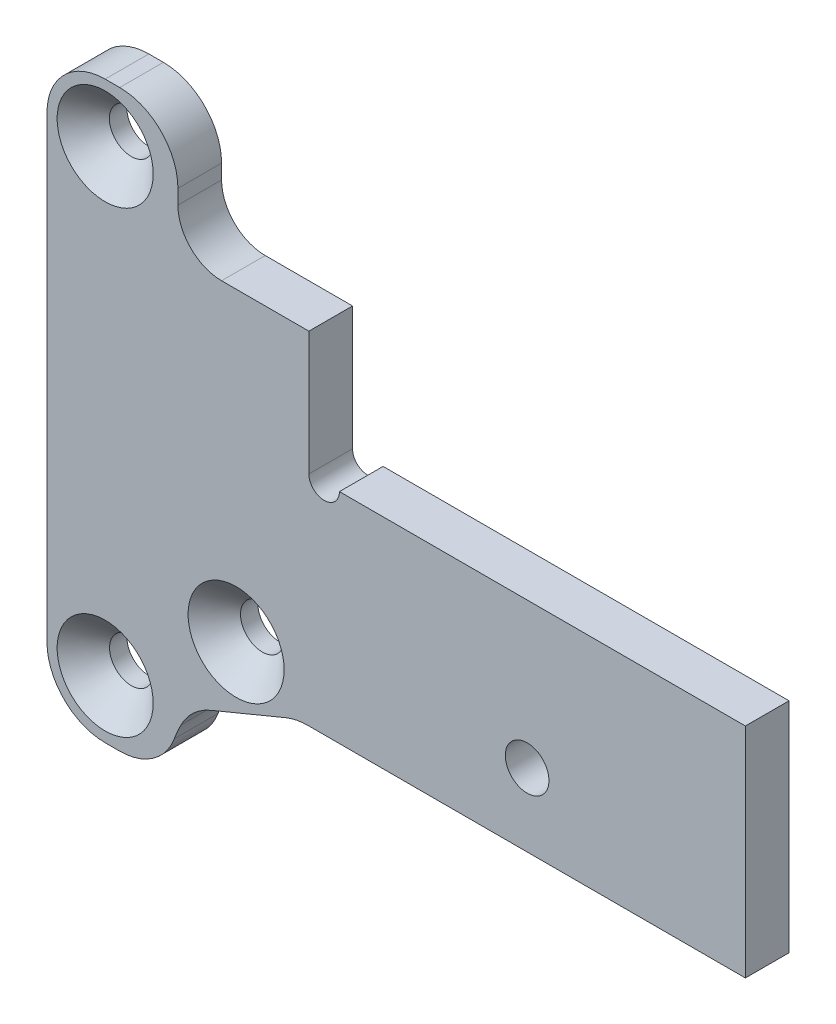
ISO-10303-21;
HEADER;
FILE_DESCRIPTION(('STEP AP214'),'2;1');
FILE_NAME('part.step','',(''),(''),'','','');
FILE_SCHEMA(('AUTOMOTIVE_DESIGN { 1 0 10303 214 1 1 1 1 }'));
ENDSEC;
DATA;
#1=APPLICATION_CONTEXT('core data for automotive mechanical design processes');
#2=APPLICATION_PROTOCOL_DEFINITION('international standard','automotive_design',2000,#1);
#3=PRODUCT_CONTEXT('',#1,'mechanical');
#4=PRODUCT('Part','Part','',(#3));
#5=PRODUCT_RELATED_PRODUCT_CATEGORY('part','',(#4));
#6=PRODUCT_DEFINITION_FORMATION('','',#4);
#7=PRODUCT_DEFINITION_CONTEXT('part definition',#1,'design');
#8=PRODUCT_DEFINITION('design','',#6,#7);
#9=PRODUCT_DEFINITION_SHAPE('','',#8);
#10=(LENGTH_UNIT() NAMED_UNIT(*) SI_UNIT(.MILLI.,.METRE.));
#11=(NAMED_UNIT(*) PLANE_ANGLE_UNIT() SI_UNIT($,.RADIAN.));
#12=(NAMED_UNIT(*) SI_UNIT($,.STERADIAN.) SOLID_ANGLE_UNIT());
#13=UNCERTAINTY_MEASURE_WITH_UNIT(LENGTH_MEASURE(1.E-05),#10,'distance_accuracy_value','');
#14=(GEOMETRIC_REPRESENTATION_CONTEXT(3) GLOBAL_UNCERTAINTY_ASSIGNED_CONTEXT((#13)) GLOBAL_UNIT_ASSIGNED_CONTEXT((#10,
#11,#12)) REPRESENTATION_CONTEXT('',''));
#15=CARTESIAN_POINT('',(0.,0.,0.));
#16=DIRECTION('',(0.,0.,1.));
#17=DIRECTION('',(1.,0.,0.));
#18=AXIS2_PLACEMENT_3D('',#15,#16,#17);
#19=CARTESIAN_POINT('',(15.,-7.5,3.));
#20=DIRECTION('',(-1.,0.,0.));
#21=DIRECTION('',(0.,0.,1.));
#22=AXIS2_PLACEMENT_3D('',#19,#20,#21);
#23=PLANE('',#22);
#24=DIRECTION('',(0.,1.,0.));
#25=VECTOR('',#24,1.);
#26=CARTESIAN_POINT('',(15.,-7.5,0.));
#27=LINE('',#26,#25);
#28=CARTESIAN_POINT('',(15.,-7.5,0.));
#29=VERTEX_POINT('',#28);
#30=CARTESIAN_POINT('',(15.,7.5,0.));
#31=VERTEX_POINT('',#30);
#32=EDGE_CURVE('E199',#29,#31,#27,.T.);
#33=ORIENTED_EDGE('',*,*,#32,.T.);
#34=DIRECTION('',(0.,0.,-1.));
#35=VECTOR('',#34,1.);
#36=CARTESIAN_POINT('',(15.,7.5,3.));
#37=LINE('',#36,#35);
#38=CARTESIAN_POINT('',(15.,7.5,3.));
#39=VERTEX_POINT('',#38);
#40=EDGE_CURVE('E208',#39,#31,#37,.T.);
#41=ORIENTED_EDGE('',*,*,#40,.F.);
#42=DIRECTION('',(0.,1.,0.));
#43=VECTOR('',#42,1.);
#44=CARTESIAN_POINT('',(15.,-7.5,3.));
#45=LINE('',#44,#43);
#46=CARTESIAN_POINT('',(15.,-7.5,3.));
#47=VERTEX_POINT('',#46);
#48=EDGE_CURVE('E189',#47,#39,#45,.T.);
#49=ORIENTED_EDGE('',*,*,#48,.F.);
#50=DIRECTION('',(0.,0.,-1.));
#51=VECTOR('',#50,1.);
#52=CARTESIAN_POINT('',(15.,-7.5,3.));
#53=LINE('',#52,#51);
#54=EDGE_CURVE('E193',#47,#29,#53,.T.);
#55=ORIENTED_EDGE('',*,*,#54,.T.);
#56=EDGE_LOOP('',(#33,#41,#49,#55));
#57=FACE_BOUND('',#56,.T.);
#58=ADVANCED_FACE('F35',(#57),#23,.F.);
#59=CARTESIAN_POINT('',(-15.,7.5,3.));
#60=DIRECTION('',(0.,-1.,0.));
#61=DIRECTION('',(0.,0.,-1.));
#62=AXIS2_PLACEMENT_3D('',#59,#60,#61);
#63=PLANE('',#62);
#64=DIRECTION('',(-1.,0.,0.));
#65=VECTOR('',#64,1.);
#66=CARTESIAN_POINT('',(-15.,7.5,0.));
#67=LINE('',#66,#65);
#68=CARTESIAN_POINT('',(-12.9,7.5,0.));
#69=VERTEX_POINT('',#68);
#70=EDGE_CURVE('E184',#31,#69,#67,.T.);
#71=ORIENTED_EDGE('',*,*,#70,.T.);
#72=DIRECTION('',(0.,0.,1.));
#73=VECTOR('',#72,1.);
#74=CARTESIAN_POINT('',(-12.9,7.5,0.));
#75=LINE('',#74,#73);
#76=CARTESIAN_POINT('',(-12.9,7.5,3.));
#77=VERTEX_POINT('',#76);
#78=EDGE_CURVE('E168',#69,#77,#75,.T.);
#79=ORIENTED_EDGE('',*,*,#78,.T.);
#80=DIRECTION('',(-1.,0.,0.));
#81=VECTOR('',#80,1.);
#82=CARTESIAN_POINT('',(-15.,7.5,3.));
#83=LINE('',#82,#81);
#84=EDGE_CURVE('E182',#39,#77,#83,.T.);
#85=ORIENTED_EDGE('',*,*,#84,.F.);
#86=ORIENTED_EDGE('',*,*,#40,.T.);
#87=EDGE_LOOP('',(#71,#79,#85,#86));
#88=FACE_BOUND('',#87,.T.);
#89=ADVANCED_FACE('F180',(#88),#63,.F.);
#90=CARTESIAN_POINT('',(-15.,-7.5,3.));
#91=DIRECTION('',(0.,1.,0.));
#92=DIRECTION('',(0.,0.,1.));
#93=AXIS2_PLACEMENT_3D('',#90,#91,#92);
#94=PLANE('',#93);
#95=DIRECTION('',(1.,0.,0.));
#96=VECTOR('',#95,1.);
#97=CARTESIAN_POINT('',(-15.,-7.5,3.));
#98=LINE('',#97,#96);
#99=CARTESIAN_POINT('',(-15.0622149067504,-7.5,3.));
#100=VERTEX_POINT('',#99);
#101=EDGE_CURVE('E191',#100,#47,#98,.T.);
#102=ORIENTED_EDGE('',*,*,#101,.F.);
#103=DIRECTION('',(0.,0.,-1.));
#104=VECTOR('',#103,1.);
#105=CARTESIAN_POINT('',(-15.0622149067504,-7.5,3.));
#106=LINE('',#105,#104);
#107=CARTESIAN_POINT('',(-15.0622149067504,-7.5,0.));
#108=VERTEX_POINT('',#107);
#109=EDGE_CURVE('E268',#100,#108,#106,.T.);
#110=ORIENTED_EDGE('',*,*,#109,.T.);
#111=DIRECTION('',(1.,0.,0.));
#112=VECTOR('',#111,1.);
#113=CARTESIAN_POINT('',(-15.,-7.5,0.));
#114=LINE('',#113,#112);
#115=EDGE_CURVE('E195',#108,#29,#114,.T.);
#116=ORIENTED_EDGE('',*,*,#115,.T.);
#117=ORIENTED_EDGE('',*,*,#54,.F.);
#118=EDGE_LOOP('',(#102,#110,#116,#117));
#119=FACE_BOUND('',#118,.T.);
#120=ADVANCED_FACE('F401',(#119),#94,.F.);
#121=CARTESIAN_POINT('',(0.,0.,3.));
#122=DIRECTION('',(0.,0.,-1.));
#123=DIRECTION('',(-1.,0.,0.));
#124=AXIS2_PLACEMENT_3D('',#121,#122,#123);
#125=PLANE('',#124);
#126=CARTESIAN_POINT('',(3.33066907387547E-13,-2.49999999999997,3.));
#127=DIRECTION('',(0.,0.,-1.));
#128=DIRECTION('',(-1.,0.,0.));
#129=AXIS2_PLACEMENT_3D('',#126,#127,#128);
#130=CIRCLE('',#129,1.5);
#131=CARTESIAN_POINT('',(-1.49999999999966,-2.49999999999997,3.));
#132=VERTEX_POINT('',#131);
#133=EDGE_CURVE('E656',#132,#132,#130,.T.);
#134=ORIENTED_EDGE('',*,*,#133,.T.);
#135=EDGE_LOOP('',(#134));
#136=FACE_BOUND('',#135,.T.);
#137=CARTESIAN_POINT('',(-29.,20.,3.));
#138=DIRECTION('',(0.,0.,1.));
#139=DIRECTION('',(1.,0.,0.));
#140=AXIS2_PLACEMENT_3D('',#137,#138,#139);
#141=CIRCLE('',#140,3.3);
#142=CARTESIAN_POINT('',(-25.7,20.,3.));
#143=VERTEX_POINT('',#142);
#144=EDGE_CURVE('E276',#143,#143,#141,.T.);
#145=ORIENTED_EDGE('',*,*,#144,.F.);
#146=EDGE_LOOP('',(#145));
#147=FACE_BOUND('',#146,.T.);
#148=CARTESIAN_POINT('',(-20.,-5.,3.));
#149=DIRECTION('',(0.,0.,1.));
#150=DIRECTION('',(1.,0.,0.));
#151=AXIS2_PLACEMENT_3D('',#148,#149,#150);
#152=CIRCLE('',#151,3.3);
#153=CARTESIAN_POINT('',(-16.7,-5.,3.));
#154=VERTEX_POINT('',#153);
#155=EDGE_CURVE('E275',#154,#154,#152,.T.);
#156=ORIENTED_EDGE('',*,*,#155,.F.);
#157=EDGE_LOOP('',(#156));
#158=FACE_BOUND('',#157,.T.);
#159=CARTESIAN_POINT('',(-29.,-11.5,3.));
#160=DIRECTION('',(0.,0.,1.));
#161=DIRECTION('',(1.,0.,0.));
#162=AXIS2_PLACEMENT_3D('',#159,#160,#161);
#163=CIRCLE('',#162,3.3);
#164=CARTESIAN_POINT('',(-25.7,-11.5,3.));
#165=VERTEX_POINT('',#164);
#166=EDGE_CURVE('E666',#165,#165,#163,.T.);
#167=ORIENTED_EDGE('',*,*,#166,.F.);
#168=EDGE_LOOP('',(#167));
#169=FACE_BOUND('',#168,.T.);
#170=ORIENTED_EDGE('',*,*,#84,.T.);
#171=CARTESIAN_POINT('',(-13.95,7.5,3.));
#172=DIRECTION('',(0.,0.,1.));
#173=DIRECTION('',(1.,0.,0.));
#174=AXIS2_PLACEMENT_3D('',#171,#172,#173);
#175=CIRCLE('',#174,1.05);
#176=CARTESIAN_POINT('',(-15.,7.5,3.));
#177=VERTEX_POINT('',#176);
#178=EDGE_CURVE('E165',#177,#77,#175,.T.);
#179=ORIENTED_EDGE('',*,*,#178,.F.);
#180=DIRECTION('',(0.,1.,0.));
#181=VECTOR('',#180,1.);
#182=CARTESIAN_POINT('',(-15.,7.5,3.));
#183=LINE('',#182,#181);
#184=CARTESIAN_POINT('',(-15.,16.,3.));
#185=VERTEX_POINT('',#184);
#186=EDGE_CURVE('E185',#177,#185,#183,.T.);
#187=ORIENTED_EDGE('',*,*,#186,.T.);
#188=DIRECTION('',(-1.,0.,0.));
#189=VECTOR('',#188,1.);
#190=CARTESIAN_POINT('',(-15.,16.,3.));
#191=LINE('',#190,#189);
#192=CARTESIAN_POINT('',(-21.,16.,3.));
#193=VERTEX_POINT('',#192);
#194=EDGE_CURVE('E329',#185,#193,#191,.T.);
#195=ORIENTED_EDGE('',*,*,#194,.T.);
#196=CARTESIAN_POINT('',(-21.,19.,3.));
#197=DIRECTION('',(0.,0.,-1.));
#198=DIRECTION('',(-1.,0.,0.));
#199=AXIS2_PLACEMENT_3D('',#196,#197,#198);
#200=CIRCLE('',#199,3.);
#201=CARTESIAN_POINT('',(-24.,19.,3.));
#202=VERTEX_POINT('',#201);
#203=EDGE_CURVE('E234',#193,#202,#200,.T.);
#204=ORIENTED_EDGE('',*,*,#203,.T.);
#205=DIRECTION('',(0.,1.,0.));
#206=VECTOR('',#205,1.);
#207=CARTESIAN_POINT('',(-24.,16.,3.));
#208=LINE('',#207,#206);
#209=CARTESIAN_POINT('',(-24.,20.,3.));
#210=VERTEX_POINT('',#209);
#211=EDGE_CURVE('E327',#202,#210,#208,.T.);
#212=ORIENTED_EDGE('',*,*,#211,.T.);
#213=CARTESIAN_POINT('',(-28.,20.,3.));
#214=DIRECTION('',(0.,0.,-1.));
#215=DIRECTION('',(-1.,0.,0.));
#216=AXIS2_PLACEMENT_3D('',#213,#214,#215);
#217=CIRCLE('',#216,4.);
#218=CARTESIAN_POINT('',(-28.,24.,3.));
#219=VERTEX_POINT('',#218);
#220=EDGE_CURVE('E215',#210,#219,#217,.F.);
#221=ORIENTED_EDGE('',*,*,#220,.T.);
#222=DIRECTION('',(-1.,0.,0.));
#223=VECTOR('',#222,1.);
#224=CARTESIAN_POINT('',(-24.,24.,3.));
#225=LINE('',#224,#223);
#226=CARTESIAN_POINT('',(-29.,24.,3.));
#227=VERTEX_POINT('',#226);
#228=EDGE_CURVE('E322',#219,#227,#225,.T.);
#229=ORIENTED_EDGE('',*,*,#228,.T.);
#230=CARTESIAN_POINT('',(-29.,20.,3.));
#231=DIRECTION('',(0.,0.,-1.));
#232=DIRECTION('',(-1.,0.,0.));
#233=AXIS2_PLACEMENT_3D('',#230,#231,#232);
#234=CIRCLE('',#233,4.);
#235=CARTESIAN_POINT('',(-33.,20.,3.));
#236=VERTEX_POINT('',#235);
#237=EDGE_CURVE('E217',#227,#236,#234,.F.);
#238=ORIENTED_EDGE('',*,*,#237,.T.);
#239=DIRECTION('',(0.,-1.,0.));
#240=VECTOR('',#239,1.);
#241=CARTESIAN_POINT('',(-33.,24.,3.));
#242=LINE('',#241,#240);
#243=CARTESIAN_POINT('',(-33.,-11.5,3.));
#244=VERTEX_POINT('',#243);
#245=EDGE_CURVE('E318',#236,#244,#242,.T.);
#246=ORIENTED_EDGE('',*,*,#245,.T.);
#247=CARTESIAN_POINT('',(-29.,-11.5,3.));
#248=DIRECTION('',(0.,0.,-1.));
#249=DIRECTION('',(-1.,0.,0.));
#250=AXIS2_PLACEMENT_3D('',#247,#248,#249);
#251=CIRCLE('',#250,4.);
#252=CARTESIAN_POINT('',(-29.,-15.5,3.));
#253=VERTEX_POINT('',#252);
#254=EDGE_CURVE('E243',#244,#253,#251,.F.);
#255=ORIENTED_EDGE('',*,*,#254,.T.);
#256=DIRECTION('',(1.,0.,0.));
#257=VECTOR('',#256,1.);
#258=CARTESIAN_POINT('',(-33.,-15.5,3.));
#259=LINE('',#258,#257);
#260=CARTESIAN_POINT('',(-28.,-15.5,3.));
#261=VERTEX_POINT('',#260);
#262=EDGE_CURVE('E314',#253,#261,#259,.T.);
#263=ORIENTED_EDGE('',*,*,#262,.T.);
#264=CARTESIAN_POINT('',(-28.,-11.5,3.));
#265=DIRECTION('',(0.,0.,-1.));
#266=DIRECTION('',(-1.,0.,0.));
#267=AXIS2_PLACEMENT_3D('',#264,#265,#266);
#268=CIRCLE('',#267,4.);
#269=CARTESIAN_POINT('',(-24.2467109842086,-12.883047925395,3.));
#270=VERTEX_POINT('',#269);
#271=EDGE_CURVE('E245',#261,#270,#268,.F.);
#272=ORIENTED_EDGE('',*,*,#271,.T.);
#273=CARTESIAN_POINT('',(-14.86348844473,-16.3406677388824,3.));
#274=DIRECTION('',(0.,0.,-1.));
#275=DIRECTION('',(-1.,0.,0.));
#276=AXIS2_PLACEMENT_3D('',#273,#274,#275);
#277=CIRCLE('',#276,10.);
#278=CARTESIAN_POINT('',(-23.7899950917155,-11.8331762989212,3.));
#279=VERTEX_POINT('',#278);
#280=EDGE_CURVE('E265',#270,#279,#277,.T.);
#281=ORIENTED_EDGE('',*,*,#280,.T.);
#282=CARTESIAN_POINT('',(-20.2193924329213,-13.6361728749057,3.));
#283=DIRECTION('',(0.,0.,-1.));
#284=DIRECTION('',(-1.,0.,0.));
#285=AXIS2_PLACEMENT_3D('',#282,#283,#284);
#286=CIRCLE('',#285,4.);
#287=CARTESIAN_POINT('',(-21.7501261623816,-9.94065474486056,3.));
#288=VERTEX_POINT('',#287);
#289=EDGE_CURVE('E44',#279,#288,#286,.T.);
#290=ORIENTED_EDGE('',*,*,#289,.T.);
#291=DIRECTION('',(0.923879532511287,0.38268343236509,0.));
#292=VECTOR('',#291,1.);
#293=CARTESIAN_POINT('',(-15.857864376269,-7.5,3.));
#294=LINE('',#293,#292);
#295=CARTESIAN_POINT('',(-16.5929486362108,-7.80448186995485,3.));
#296=VERTEX_POINT('',#295);
#297=EDGE_CURVE('E291',#288,#296,#294,.T.);
#298=ORIENTED_EDGE('',*,*,#297,.T.);
#299=CARTESIAN_POINT('',(-15.0622149067504,-11.5,3.));
#300=DIRECTION('',(0.,0.,-1.));
#301=DIRECTION('',(-1.,0.,0.));
#302=AXIS2_PLACEMENT_3D('',#299,#300,#301);
#303=CIRCLE('',#302,4.);
#304=EDGE_CURVE('E287',#296,#100,#303,.T.);
#305=ORIENTED_EDGE('',*,*,#304,.T.);
#306=ORIENTED_EDGE('',*,*,#101,.T.);
#307=ORIENTED_EDGE('',*,*,#48,.T.);
#308=EDGE_LOOP('',(#170,#179,#187,#195,#204,#212,#221,#229,#238,#246,#255,#263,#272,#281,#290,
#298,#305,#306,#307));
#309=FACE_BOUND('',#308,.T.);
#310=ADVANCED_FACE('F187',(#136,#147,#158,#169,#309),#125,.F.);
#311=CARTESIAN_POINT('',(0.,0.,0.));
#312=DIRECTION('',(0.,0.,-1.));
#313=DIRECTION('',(-1.,0.,0.));
#314=AXIS2_PLACEMENT_3D('',#311,#312,#313);
#315=PLANE('',#314);
#316=CARTESIAN_POINT('',(3.33066907387547E-13,-2.49999999999997,0.));
#317=DIRECTION('',(0.,0.,-1.));
#318=DIRECTION('',(-1.,0.,0.));
#319=AXIS2_PLACEMENT_3D('',#316,#317,#318);
#320=CIRCLE('',#319,1.5);
#321=CARTESIAN_POINT('',(-1.49999999999966,-2.49999999999997,0.));
#322=VERTEX_POINT('',#321);
#323=EDGE_CURVE('E39',#322,#322,#320,.T.);
#324=ORIENTED_EDGE('',*,*,#323,.F.);
#325=EDGE_LOOP('',(#324));
#326=FACE_BOUND('',#325,.T.);
#327=CARTESIAN_POINT('',(-29.,-11.5,0.));
#328=DIRECTION('',(0.,0.,-1.));
#329=DIRECTION('',(-1.,0.,0.));
#330=AXIS2_PLACEMENT_3D('',#327,#328,#329);
#331=CIRCLE('',#330,1.5);
#332=CARTESIAN_POINT('',(-30.5,-11.5,0.));
#333=VERTEX_POINT('',#332);
#334=EDGE_CURVE('E261',#333,#333,#331,.T.);
#335=ORIENTED_EDGE('',*,*,#334,.F.);
#336=EDGE_LOOP('',(#335));
#337=FACE_BOUND('',#336,.T.);
#338=CARTESIAN_POINT('',(-20.,-5.,0.));
#339=DIRECTION('',(0.,0.,-1.));
#340=DIRECTION('',(-1.,0.,0.));
#341=AXIS2_PLACEMENT_3D('',#338,#339,#340);
#342=CIRCLE('',#341,1.5);
#343=CARTESIAN_POINT('',(-21.5,-5.,0.));
#344=VERTEX_POINT('',#343);
#345=EDGE_CURVE('E258',#344,#344,#342,.T.);
#346=ORIENTED_EDGE('',*,*,#345,.F.);
#347=EDGE_LOOP('',(#346));
#348=FACE_BOUND('',#347,.T.);
#349=CARTESIAN_POINT('',(-29.,20.,0.));
#350=DIRECTION('',(0.,0.,-1.));
#351=DIRECTION('',(-1.,0.,0.));
#352=AXIS2_PLACEMENT_3D('',#349,#350,#351);
#353=CIRCLE('',#352,1.505);
#354=CARTESIAN_POINT('',(-30.505,20.,0.));
#355=VERTEX_POINT('',#354);
#356=EDGE_CURVE('E176',#355,#355,#353,.T.);
#357=ORIENTED_EDGE('',*,*,#356,.F.);
#358=EDGE_LOOP('',(#357));
#359=FACE_BOUND('',#358,.T.);
#360=CARTESIAN_POINT('',(-13.95,7.5,0.));
#361=DIRECTION('',(0.,0.,1.));
#362=DIRECTION('',(1.,0.,0.));
#363=AXIS2_PLACEMENT_3D('',#360,#361,#362);
#364=CIRCLE('',#363,1.05);
#365=CARTESIAN_POINT('',(-15.,7.5,0.));
#366=VERTEX_POINT('',#365);
#367=EDGE_CURVE('E175',#366,#69,#364,.T.);
#368=ORIENTED_EDGE('',*,*,#367,.T.);
#369=ORIENTED_EDGE('',*,*,#70,.F.);
#370=ORIENTED_EDGE('',*,*,#32,.F.);
#371=ORIENTED_EDGE('',*,*,#115,.F.);
#372=CARTESIAN_POINT('',(-15.0622149067504,-11.5,0.));
#373=DIRECTION('',(0.,0.,-1.));
#374=DIRECTION('',(-1.,0.,0.));
#375=AXIS2_PLACEMENT_3D('',#372,#373,#374);
#376=CIRCLE('',#375,4.);
#377=CARTESIAN_POINT('',(-16.5929486362108,-7.80448186995485,0.));
#378=VERTEX_POINT('',#377);
#379=EDGE_CURVE('E285',#108,#378,#376,.F.);
#380=ORIENTED_EDGE('',*,*,#379,.T.);
#381=DIRECTION('',(0.923879532511287,0.38268343236509,0.));
#382=VECTOR('',#381,1.);
#383=CARTESIAN_POINT('',(-15.857864376269,-7.5,0.));
#384=LINE('',#383,#382);
#385=CARTESIAN_POINT('',(-21.7501261623816,-9.94065474486056,0.));
#386=VERTEX_POINT('',#385);
#387=EDGE_CURVE('E271',#386,#378,#384,.T.);
#388=ORIENTED_EDGE('',*,*,#387,.F.);
#389=CARTESIAN_POINT('',(-20.2193924329213,-13.6361728749057,0.));
#390=DIRECTION('',(0.,0.,-1.));
#391=DIRECTION('',(-1.,0.,0.));
#392=AXIS2_PLACEMENT_3D('',#389,#390,#391);
#393=CIRCLE('',#392,4.);
#394=CARTESIAN_POINT('',(-23.7899950917155,-11.8331762989212,0.));
#395=VERTEX_POINT('',#394);
#396=EDGE_CURVE('E11',#386,#395,#393,.F.);
#397=ORIENTED_EDGE('',*,*,#396,.T.);
#398=CARTESIAN_POINT('',(-14.86348844473,-16.3406677388824,0.));
#399=DIRECTION('',(0.,0.,-1.));
#400=DIRECTION('',(-1.,0.,0.));
#401=AXIS2_PLACEMENT_3D('',#398,#399,#400);
#402=CIRCLE('',#401,10.);
#403=CARTESIAN_POINT('',(-24.2467109842086,-12.883047925395,0.));
#404=VERTEX_POINT('',#403);
#405=EDGE_CURVE('E263',#395,#404,#402,.F.);
#406=ORIENTED_EDGE('',*,*,#405,.T.);
#407=CARTESIAN_POINT('',(-28.,-11.5,0.));
#408=DIRECTION('',(0.,0.,-1.));
#409=DIRECTION('',(-1.,0.,0.));
#410=AXIS2_PLACEMENT_3D('',#407,#408,#409);
#411=CIRCLE('',#410,4.);
#412=CARTESIAN_POINT('',(-28.,-15.5,0.));
#413=VERTEX_POINT('',#412);
#414=EDGE_CURVE('E250',#404,#413,#411,.T.);
#415=ORIENTED_EDGE('',*,*,#414,.T.);
#416=DIRECTION('',(1.,0.,0.));
#417=VECTOR('',#416,1.);
#418=CARTESIAN_POINT('',(-33.,-15.5,0.));
#419=LINE('',#418,#417);
#420=CARTESIAN_POINT('',(-29.,-15.5,0.));
#421=VERTEX_POINT('',#420);
#422=EDGE_CURVE('E202',#421,#413,#419,.T.);
#423=ORIENTED_EDGE('',*,*,#422,.F.);
#424=CARTESIAN_POINT('',(-29.,-11.5,0.));
#425=DIRECTION('',(0.,0.,-1.));
#426=DIRECTION('',(-1.,0.,0.));
#427=AXIS2_PLACEMENT_3D('',#424,#425,#426);
#428=CIRCLE('',#427,4.);
#429=CARTESIAN_POINT('',(-33.,-11.5,0.));
#430=VERTEX_POINT('',#429);
#431=EDGE_CURVE('E248',#421,#430,#428,.T.);
#432=ORIENTED_EDGE('',*,*,#431,.T.);
#433=DIRECTION('',(0.,-1.,0.));
#434=VECTOR('',#433,1.);
#435=CARTESIAN_POINT('',(-33.,24.,0.));
#436=LINE('',#435,#434);
#437=CARTESIAN_POINT('',(-33.,20.,0.));
#438=VERTEX_POINT('',#437);
#439=EDGE_CURVE('E334',#438,#430,#436,.T.);
#440=ORIENTED_EDGE('',*,*,#439,.F.);
#441=CARTESIAN_POINT('',(-29.,20.,0.));
#442=DIRECTION('',(0.,0.,-1.));
#443=DIRECTION('',(-1.,0.,0.));
#444=AXIS2_PLACEMENT_3D('',#441,#442,#443);
#445=CIRCLE('',#444,4.);
#446=CARTESIAN_POINT('',(-29.,24.,0.));
#447=VERTEX_POINT('',#446);
#448=EDGE_CURVE('E224',#438,#447,#445,.T.);
#449=ORIENTED_EDGE('',*,*,#448,.T.);
#450=DIRECTION('',(-1.,0.,0.));
#451=VECTOR('',#450,1.);
#452=CARTESIAN_POINT('',(-24.,24.,0.));
#453=LINE('',#452,#451);
#454=CARTESIAN_POINT('',(-28.,24.,0.));
#455=VERTEX_POINT('',#454);
#456=EDGE_CURVE('E337',#455,#447,#453,.T.);
#457=ORIENTED_EDGE('',*,*,#456,.F.);
#458=CARTESIAN_POINT('',(-28.,20.,0.));
#459=DIRECTION('',(0.,0.,-1.));
#460=DIRECTION('',(-1.,0.,0.));
#461=AXIS2_PLACEMENT_3D('',#458,#459,#460);
#462=CIRCLE('',#461,4.);
#463=CARTESIAN_POINT('',(-24.,20.,0.));
#464=VERTEX_POINT('',#463);
#465=EDGE_CURVE('E221',#455,#464,#462,.T.);
#466=ORIENTED_EDGE('',*,*,#465,.T.);
#467=DIRECTION('',(0.,1.,0.));
#468=VECTOR('',#467,1.);
#469=CARTESIAN_POINT('',(-24.,16.,0.));
#470=LINE('',#469,#468);
#471=CARTESIAN_POINT('',(-24.,19.,0.));
#472=VERTEX_POINT('',#471);
#473=EDGE_CURVE('E340',#472,#464,#470,.T.);
#474=ORIENTED_EDGE('',*,*,#473,.F.);
#475=CARTESIAN_POINT('',(-21.,19.,0.));
#476=DIRECTION('',(0.,0.,-1.));
#477=DIRECTION('',(-1.,0.,0.));
#478=AXIS2_PLACEMENT_3D('',#475,#476,#477);
#479=CIRCLE('',#478,3.);
#480=CARTESIAN_POINT('',(-21.,16.,0.));
#481=VERTEX_POINT('',#480);
#482=EDGE_CURVE('E236',#472,#481,#479,.F.);
#483=ORIENTED_EDGE('',*,*,#482,.T.);
#484=DIRECTION('',(-1.,0.,0.));
#485=VECTOR('',#484,1.);
#486=CARTESIAN_POINT('',(-15.,16.,0.));
#487=LINE('',#486,#485);
#488=CARTESIAN_POINT('',(-15.,16.,0.));
#489=VERTEX_POINT('',#488);
#490=EDGE_CURVE('E342',#489,#481,#487,.T.);
#491=ORIENTED_EDGE('',*,*,#490,.F.);
#492=DIRECTION('',(0.,1.,0.));
#493=VECTOR('',#492,1.);
#494=CARTESIAN_POINT('',(-15.,7.5,0.));
#495=LINE('',#494,#493);
#496=EDGE_CURVE('E317',#366,#489,#495,.T.);
#497=ORIENTED_EDGE('',*,*,#496,.F.);
#498=EDGE_LOOP('',(#368,#369,#370,#371,#380,#388,#397,#406,#415,#423,#432,#440,#449,#457,#466,
#474,#483,#491,#497));
#499=FACE_BOUND('',#498,.T.);
#500=ADVANCED_FACE('F304',(#326,#337,#348,#359,#499),#315,.T.);
#501=CARTESIAN_POINT('',(-15.,7.5,-43.4079485808763));
#502=DIRECTION('',(1.,0.,0.));
#503=DIRECTION('',(0.,0.,-1.));
#504=AXIS2_PLACEMENT_3D('',#501,#502,#503);
#505=PLANE('',#504);
#506=ORIENTED_EDGE('',*,*,#186,.F.);
#507=DIRECTION('',(0.,0.,-1.));
#508=VECTOR('',#507,1.);
#509=CARTESIAN_POINT('',(-15.,7.5,3.));
#510=LINE('',#509,#508);
#511=EDGE_CURVE('E171',#177,#366,#510,.T.);
#512=ORIENTED_EDGE('',*,*,#511,.T.);
#513=ORIENTED_EDGE('',*,*,#496,.T.);
#514=DIRECTION('',(0.,0.,1.));
#515=VECTOR('',#514,1.);
#516=CARTESIAN_POINT('',(-15.,16.,-43.4079485808763));
#517=LINE('',#516,#515);
#518=EDGE_CURVE('E320',#489,#185,#517,.T.);
#519=ORIENTED_EDGE('',*,*,#518,.T.);
#520=EDGE_LOOP('',(#506,#512,#513,#519));
#521=FACE_BOUND('',#520,.T.);
#522=ADVANCED_FACE('F348',(#521),#505,.T.);
#523=CARTESIAN_POINT('',(-15.,16.,-43.4079485808763));
#524=DIRECTION('',(0.,1.,0.));
#525=DIRECTION('',(0.,0.,1.));
#526=AXIS2_PLACEMENT_3D('',#523,#524,#525);
#527=PLANE('',#526);
#528=ORIENTED_EDGE('',*,*,#490,.T.);
#529=DIRECTION('',(0.,0.,1.));
#530=VECTOR('',#529,1.);
#531=CARTESIAN_POINT('',(-21.,16.,3.));
#532=LINE('',#531,#530);
#533=EDGE_CURVE('E229',#481,#193,#532,.T.);
#534=ORIENTED_EDGE('',*,*,#533,.T.);
#535=ORIENTED_EDGE('',*,*,#194,.F.);
#536=ORIENTED_EDGE('',*,*,#518,.F.);
#537=EDGE_LOOP('',(#528,#534,#535,#536));
#538=FACE_BOUND('',#537,.T.);
#539=ADVANCED_FACE('F352',(#538),#527,.T.);
#540=CARTESIAN_POINT('',(-24.,16.,-43.4079485808763));
#541=DIRECTION('',(1.,0.,0.));
#542=DIRECTION('',(0.,1.,0.));
#543=AXIS2_PLACEMENT_3D('',#540,#541,#542);
#544=PLANE('',#543);
#545=ORIENTED_EDGE('',*,*,#211,.F.);
#546=DIRECTION('',(0.,0.,1.));
#547=VECTOR('',#546,1.);
#548=CARTESIAN_POINT('',(-24.,19.,0.));
#549=LINE('',#548,#547);
#550=EDGE_CURVE('E232',#202,#472,#549,.F.);
#551=ORIENTED_EDGE('',*,*,#550,.T.);
#552=ORIENTED_EDGE('',*,*,#473,.T.);
#553=DIRECTION('',(0.,0.,1.));
#554=VECTOR('',#553,1.);
#555=CARTESIAN_POINT('',(-24.,20.,-43.4079485808763));
#556=LINE('',#555,#554);
#557=EDGE_CURVE('E226',#464,#210,#556,.T.);
#558=ORIENTED_EDGE('',*,*,#557,.T.);
#559=EDGE_LOOP('',(#545,#551,#552,#558));
#560=FACE_BOUND('',#559,.T.);
#561=ADVANCED_FACE('F359',(#560),#544,.T.);
#562=CARTESIAN_POINT('',(-24.,24.,-43.4079485808763));
#563=DIRECTION('',(0.,1.,0.));
#564=DIRECTION('',(0.,0.,1.));
#565=AXIS2_PLACEMENT_3D('',#562,#563,#564);
#566=PLANE('',#565);
#567=ORIENTED_EDGE('',*,*,#456,.T.);
#568=DIRECTION('',(0.,0.,1.));
#569=VECTOR('',#568,1.);
#570=CARTESIAN_POINT('',(-29.,24.,-43.4079485808763));
#571=LINE('',#570,#569);
#572=EDGE_CURVE('E212',#447,#227,#571,.T.);
#573=ORIENTED_EDGE('',*,*,#572,.T.);
#574=ORIENTED_EDGE('',*,*,#228,.F.);
#575=DIRECTION('',(0.,0.,1.));
#576=VECTOR('',#575,1.);
#577=CARTESIAN_POINT('',(-28.,24.,-43.4079485808763));
#578=LINE('',#577,#576);
#579=EDGE_CURVE('E210',#219,#455,#578,.F.);
#580=ORIENTED_EDGE('',*,*,#579,.T.);
#581=EDGE_LOOP('',(#567,#573,#574,#580));
#582=FACE_BOUND('',#581,.T.);
#583=ADVANCED_FACE('F371',(#582),#566,.T.);
#584=CARTESIAN_POINT('',(-33.,24.,-43.4079485808763));
#585=DIRECTION('',(-1.,0.,0.));
#586=DIRECTION('',(0.,-1.,0.));
#587=AXIS2_PLACEMENT_3D('',#584,#585,#586);
#588=PLANE('',#587);
#589=ORIENTED_EDGE('',*,*,#439,.T.);
#590=DIRECTION('',(0.,0.,1.));
#591=VECTOR('',#590,1.);
#592=CARTESIAN_POINT('',(-33.,-11.5,-43.4079485808763));
#593=LINE('',#592,#591);
#594=EDGE_CURVE('E252',#430,#244,#593,.T.);
#595=ORIENTED_EDGE('',*,*,#594,.T.);
#596=ORIENTED_EDGE('',*,*,#245,.F.);
#597=DIRECTION('',(0.,0.,1.));
#598=VECTOR('',#597,1.);
#599=CARTESIAN_POINT('',(-33.,20.,-43.4079485808763));
#600=LINE('',#599,#598);
#601=EDGE_CURVE('E219',#236,#438,#600,.F.);
#602=ORIENTED_EDGE('',*,*,#601,.T.);
#603=EDGE_LOOP('',(#589,#595,#596,#602));
#604=FACE_BOUND('',#603,.T.);
#605=ADVANCED_FACE('F379',(#604),#588,.T.);
#606=CARTESIAN_POINT('',(-33.,-15.5,-43.4079485808763));
#607=DIRECTION('',(0.,-1.,0.));
#608=DIRECTION('',(0.,0.,-1.));
#609=AXIS2_PLACEMENT_3D('',#606,#607,#608);
#610=PLANE('',#609);
#611=ORIENTED_EDGE('',*,*,#422,.T.);
#612=DIRECTION('',(0.,0.,1.));
#613=VECTOR('',#612,1.);
#614=CARTESIAN_POINT('',(-28.,-15.5,-43.4079485808763));
#615=LINE('',#614,#613);
#616=EDGE_CURVE('E240',#413,#261,#615,.T.);
#617=ORIENTED_EDGE('',*,*,#616,.T.);
#618=ORIENTED_EDGE('',*,*,#262,.F.);
#619=DIRECTION('',(0.,0.,1.));
#620=VECTOR('',#619,1.);
#621=CARTESIAN_POINT('',(-29.,-15.5,-43.4079485808763));
#622=LINE('',#621,#620);
#623=EDGE_CURVE('E238',#253,#421,#622,.F.);
#624=ORIENTED_EDGE('',*,*,#623,.T.);
#625=EDGE_LOOP('',(#611,#617,#618,#624));
#626=FACE_BOUND('',#625,.T.);
#627=ADVANCED_FACE('F313',(#626),#610,.T.);
#628=CARTESIAN_POINT('',(-29.,20.,-43.4079485808763));
#629=DIRECTION('',(0.,0.,1.));
#630=DIRECTION('',(1.,0.,0.));
#631=AXIS2_PLACEMENT_3D('',#628,#629,#630);
#632=CYLINDRICAL_SURFACE('',#631,4.);
#633=ORIENTED_EDGE('',*,*,#448,.F.);
#634=ORIENTED_EDGE('',*,*,#601,.F.);
#635=ORIENTED_EDGE('',*,*,#237,.F.);
#636=ORIENTED_EDGE('',*,*,#572,.F.);
#637=EDGE_LOOP('',(#633,#634,#635,#636));
#638=FACE_BOUND('',#637,.T.);
#639=ADVANCED_FACE('F375',(#638),#632,.T.);
#640=CARTESIAN_POINT('',(-28.,20.,-43.4079485808763));
#641=DIRECTION('',(0.,0.,1.));
#642=DIRECTION('',(1.,0.,0.));
#643=AXIS2_PLACEMENT_3D('',#640,#641,#642);
#644=CYLINDRICAL_SURFACE('',#643,4.);
#645=ORIENTED_EDGE('',*,*,#465,.F.);
#646=ORIENTED_EDGE('',*,*,#579,.F.);
#647=ORIENTED_EDGE('',*,*,#220,.F.);
#648=ORIENTED_EDGE('',*,*,#557,.F.);
#649=EDGE_LOOP('',(#645,#646,#647,#648));
#650=FACE_BOUND('',#649,.T.);
#651=ADVANCED_FACE('F368',(#650),#644,.T.);
#652=CARTESIAN_POINT('',(-21.,19.,-43.4079485808763));
#653=DIRECTION('',(0.,0.,-1.));
#654=DIRECTION('',(-1.,0.,0.));
#655=AXIS2_PLACEMENT_3D('',#652,#653,#654);
#656=CYLINDRICAL_SURFACE('',#655,3.);
#657=ORIENTED_EDGE('',*,*,#482,.F.);
#658=ORIENTED_EDGE('',*,*,#550,.F.);
#659=ORIENTED_EDGE('',*,*,#203,.F.);
#660=ORIENTED_EDGE('',*,*,#533,.F.);
#661=EDGE_LOOP('',(#657,#658,#659,#660));
#662=FACE_BOUND('',#661,.T.);
#663=ADVANCED_FACE('F363',(#662),#656,.F.);
#664=CARTESIAN_POINT('',(-28.,-11.5,-43.4079485808763));
#665=DIRECTION('',(0.,0.,1.));
#666=DIRECTION('',(1.,0.,0.));
#667=AXIS2_PLACEMENT_3D('',#664,#665,#666);
#668=CYLINDRICAL_SURFACE('',#667,4.);
#669=ORIENTED_EDGE('',*,*,#414,.F.);
#670=DIRECTION('',(0.,0.,1.));
#671=VECTOR('',#670,1.);
#672=CARTESIAN_POINT('',(-24.2467109842086,-12.883047925395,-43.4079485808763));
#673=LINE('',#672,#671);
#674=EDGE_CURVE('E255',#404,#270,#673,.T.);
#675=ORIENTED_EDGE('',*,*,#674,.T.);
#676=ORIENTED_EDGE('',*,*,#271,.F.);
#677=ORIENTED_EDGE('',*,*,#616,.F.);
#678=EDGE_LOOP('',(#669,#675,#676,#677));
#679=FACE_BOUND('',#678,.T.);
#680=ADVANCED_FACE('F309',(#679),#668,.T.);
#681=CARTESIAN_POINT('',(-29.,-11.5,-43.4079485808763));
#682=DIRECTION('',(0.,0.,1.));
#683=DIRECTION('',(1.,0.,0.));
#684=AXIS2_PLACEMENT_3D('',#681,#682,#683);
#685=CYLINDRICAL_SURFACE('',#684,4.);
#686=ORIENTED_EDGE('',*,*,#431,.F.);
#687=ORIENTED_EDGE('',*,*,#623,.F.);
#688=ORIENTED_EDGE('',*,*,#254,.F.);
#689=ORIENTED_EDGE('',*,*,#594,.F.);
#690=EDGE_LOOP('',(#686,#687,#688,#689));
#691=FACE_BOUND('',#690,.T.);
#692=ADVANCED_FACE('F384',(#691),#685,.T.);
#693=CARTESIAN_POINT('',(-13.95,7.5,0.));
#694=DIRECTION('',(0.,0.,1.));
#695=DIRECTION('',(1.,0.,0.));
#696=AXIS2_PLACEMENT_3D('',#693,#694,#695);
#697=CYLINDRICAL_SURFACE('',#696,1.05);
#698=ORIENTED_EDGE('',*,*,#367,.F.);
#699=ORIENTED_EDGE('',*,*,#511,.F.);
#700=ORIENTED_EDGE('',*,*,#178,.T.);
#701=ORIENTED_EDGE('',*,*,#78,.F.);
#702=EDGE_LOOP('',(#698,#699,#700,#701));
#703=FACE_BOUND('',#702,.T.);
#704=ADVANCED_FACE('F167',(#703),#697,.F.);
#705=CARTESIAN_POINT('',(-29.,20.,-37.));
#706=DIRECTION('',(0.,0.,1.));
#707=DIRECTION('',(1.,0.,0.));
#708=AXIS2_PLACEMENT_3D('',#705,#706,#707);
#709=CYLINDRICAL_SURFACE('',#708,1.505);
#710=CARTESIAN_POINT('',(-29.,20.,1.205));
#711=DIRECTION('',(0.,0.,1.));
#712=DIRECTION('',(1.,0.,0.));
#713=AXIS2_PLACEMENT_3D('',#710,#711,#712);
#714=CIRCLE('',#713,1.505);
#715=CARTESIAN_POINT('',(-27.495,20.,1.205));
#716=VERTEX_POINT('',#715);
#717=EDGE_CURVE('E272',#716,#716,#714,.T.);
#718=ORIENTED_EDGE('',*,*,#717,.T.);
#719=EDGE_LOOP('',(#718));
#720=FACE_BOUND('',#719,.T.);
#721=ORIENTED_EDGE('',*,*,#356,.T.);
#722=EDGE_LOOP('',(#721));
#723=FACE_BOUND('',#722,.T.);
#724=ADVANCED_FACE('F391',(#720,#723),#709,.F.);
#725=CARTESIAN_POINT('',(-20.,-5.,-37.));
#726=DIRECTION('',(0.,0.,1.));
#727=DIRECTION('',(1.,0.,0.));
#728=AXIS2_PLACEMENT_3D('',#725,#726,#727);
#729=CYLINDRICAL_SURFACE('',#728,1.5);
#730=CARTESIAN_POINT('',(-20.,-5.,1.2));
#731=DIRECTION('',(0.,0.,1.));
#732=DIRECTION('',(1.,0.,0.));
#733=AXIS2_PLACEMENT_3D('',#730,#731,#732);
#734=CIRCLE('',#733,1.5);
#735=CARTESIAN_POINT('',(-18.5,-5.,1.2));
#736=VERTEX_POINT('',#735);
#737=EDGE_CURVE('E663',#736,#736,#734,.T.);
#738=ORIENTED_EDGE('',*,*,#737,.T.);
#739=EDGE_LOOP('',(#738));
#740=FACE_BOUND('',#739,.T.);
#741=ORIENTED_EDGE('',*,*,#345,.T.);
#742=EDGE_LOOP('',(#741));
#743=FACE_BOUND('',#742,.T.);
#744=ADVANCED_FACE('F434',(#740,#743),#729,.F.);
#745=CARTESIAN_POINT('',(-14.86348844473,-16.3406677388824,-43.4079485808763));
#746=DIRECTION('',(0.,0.,1.));
#747=DIRECTION('',(1.,0.,0.));
#748=AXIS2_PLACEMENT_3D('',#745,#746,#747);
#749=CYLINDRICAL_SURFACE('',#748,10.);
#750=ORIENTED_EDGE('',*,*,#405,.F.);
#751=DIRECTION('',(0.,0.,1.));
#752=VECTOR('',#751,1.);
#753=CARTESIAN_POINT('',(-23.7899950917155,-11.8331762989212,-43.4079485808763));
#754=LINE('',#753,#752);
#755=EDGE_CURVE('E283',#395,#279,#754,.T.);
#756=ORIENTED_EDGE('',*,*,#755,.T.);
#757=ORIENTED_EDGE('',*,*,#280,.F.);
#758=ORIENTED_EDGE('',*,*,#674,.F.);
#759=EDGE_LOOP('',(#750,#756,#757,#758));
#760=FACE_BOUND('',#759,.T.);
#761=ADVANCED_FACE('F301',(#760),#749,.F.);
#762=CARTESIAN_POINT('',(-29.,-11.5,-37.));
#763=DIRECTION('',(0.,0.,1.));
#764=DIRECTION('',(1.,0.,0.));
#765=AXIS2_PLACEMENT_3D('',#762,#763,#764);
#766=CYLINDRICAL_SURFACE('',#765,1.5);
#767=CARTESIAN_POINT('',(-29.,-11.5,1.2));
#768=DIRECTION('',(0.,0.,1.));
#769=DIRECTION('',(1.,0.,0.));
#770=AXIS2_PLACEMENT_3D('',#767,#768,#769);
#771=CIRCLE('',#770,1.5);
#772=CARTESIAN_POINT('',(-27.5,-11.5,1.2));
#773=VERTEX_POINT('',#772);
#774=EDGE_CURVE('E298',#773,#773,#771,.T.);
#775=ORIENTED_EDGE('',*,*,#774,.T.);
#776=EDGE_LOOP('',(#775));
#777=FACE_BOUND('',#776,.T.);
#778=ORIENTED_EDGE('',*,*,#334,.T.);
#779=EDGE_LOOP('',(#778));
#780=FACE_BOUND('',#779,.T.);
#781=ADVANCED_FACE('F453',(#777,#780),#766,.F.);
#782=CARTESIAN_POINT('',(-15.857864376269,-7.5,-7.6536686473018));
#783=DIRECTION('',(0.38268343236509,-0.923879532511287,0.));
#784=DIRECTION('',(0.923879532511287,0.38268343236509,0.));
#785=AXIS2_PLACEMENT_3D('',#782,#783,#784);
#786=PLANE('',#785);
#787=ORIENTED_EDGE('',*,*,#387,.T.);
#788=DIRECTION('',(0.,0.,-1.));
#789=VECTOR('',#788,1.);
#790=CARTESIAN_POINT('',(-16.5929486362108,-7.80448186995485,-7.6536686473018));
#791=LINE('',#790,#789);
#792=EDGE_CURVE('E281',#378,#296,#791,.F.);
#793=ORIENTED_EDGE('',*,*,#792,.T.);
#794=ORIENTED_EDGE('',*,*,#297,.F.);
#795=DIRECTION('',(0.,0.,1.));
#796=VECTOR('',#795,1.);
#797=CARTESIAN_POINT('',(-21.7501261623816,-9.94065474486056,-7.6536686473018));
#798=LINE('',#797,#796);
#799=EDGE_CURVE('E279',#288,#386,#798,.F.);
#800=ORIENTED_EDGE('',*,*,#799,.T.);
#801=EDGE_LOOP('',(#787,#793,#794,#800));
#802=FACE_BOUND('',#801,.T.);
#803=ADVANCED_FACE('F296',(#802),#786,.T.);
#804=CARTESIAN_POINT('',(-29.,-11.5,3.));
#805=DIRECTION('',(0.,0.,1.));
#806=DIRECTION('',(1.,0.,0.));
#807=AXIS2_PLACEMENT_3D('',#804,#805,#806);
#808=CONICAL_SURFACE('',#807,3.3,0.785398163397449);
#809=ORIENTED_EDGE('',*,*,#774,.F.);
#810=EDGE_LOOP('',(#809));
#811=FACE_BOUND('',#810,.T.);
#812=ORIENTED_EDGE('',*,*,#166,.T.);
#813=EDGE_LOOP('',(#812));
#814=FACE_BOUND('',#813,.T.);
#815=ADVANCED_FACE('F465',(#811,#814),#808,.F.);
#816=CARTESIAN_POINT('',(-20.,-5.,3.));
#817=DIRECTION('',(0.,0.,1.));
#818=DIRECTION('',(1.,0.,0.));
#819=AXIS2_PLACEMENT_3D('',#816,#817,#818);
#820=CONICAL_SURFACE('',#819,3.3,0.785398163397449);
#821=ORIENTED_EDGE('',*,*,#737,.F.);
#822=EDGE_LOOP('',(#821));
#823=FACE_BOUND('',#822,.T.);
#824=ORIENTED_EDGE('',*,*,#155,.T.);
#825=EDGE_LOOP('',(#824));
#826=FACE_BOUND('',#825,.T.);
#827=ADVANCED_FACE('F470',(#823,#826),#820,.F.);
#828=CARTESIAN_POINT('',(-29.,20.,3.));
#829=DIRECTION('',(0.,0.,1.));
#830=DIRECTION('',(1.,0.,0.));
#831=AXIS2_PLACEMENT_3D('',#828,#829,#830);
#832=CONICAL_SURFACE('',#831,3.3,0.785398163397449);
#833=ORIENTED_EDGE('',*,*,#144,.T.);
#834=EDGE_LOOP('',(#833));
#835=FACE_BOUND('',#834,.T.);
#836=ORIENTED_EDGE('',*,*,#717,.F.);
#837=EDGE_LOOP('',(#836));
#838=FACE_BOUND('',#837,.T.);
#839=ADVANCED_FACE('F481',(#835,#838),#832,.F.);
#840=CARTESIAN_POINT('',(-15.0622149067504,-11.5,3.));
#841=DIRECTION('',(0.,0.,-1.));
#842=DIRECTION('',(-1.,0.,0.));
#843=AXIS2_PLACEMENT_3D('',#840,#841,#842);
#844=CYLINDRICAL_SURFACE('',#843,4.);
#845=ORIENTED_EDGE('',*,*,#304,.F.);
#846=ORIENTED_EDGE('',*,*,#792,.F.);
#847=ORIENTED_EDGE('',*,*,#379,.F.);
#848=ORIENTED_EDGE('',*,*,#109,.F.);
#849=EDGE_LOOP('',(#845,#846,#847,#848));
#850=FACE_BOUND('',#849,.T.);
#851=ADVANCED_FACE('F491',(#850),#844,.F.);
#852=CARTESIAN_POINT('',(-20.2193924329213,-13.6361728749057,-43.4079485808763));
#853=DIRECTION('',(0.,0.,1.));
#854=DIRECTION('',(1.,0.,0.));
#855=AXIS2_PLACEMENT_3D('',#852,#853,#854);
#856=CYLINDRICAL_SURFACE('',#855,4.);
#857=ORIENTED_EDGE('',*,*,#396,.F.);
#858=ORIENTED_EDGE('',*,*,#799,.F.);
#859=ORIENTED_EDGE('',*,*,#289,.F.);
#860=ORIENTED_EDGE('',*,*,#755,.F.);
#861=EDGE_LOOP('',(#857,#858,#859,#860));
#862=FACE_BOUND('',#861,.T.);
#863=ADVANCED_FACE('F37',(#862),#856,.F.);
#864=CARTESIAN_POINT('',(3.33066907387547E-13,-2.49999999999997,-17.5));
#865=DIRECTION('',(0.,0.,1.));
#866=DIRECTION('',(1.,0.,0.));
#867=AXIS2_PLACEMENT_3D('',#864,#865,#866);
#868=CYLINDRICAL_SURFACE('',#867,1.5);
#869=ORIENTED_EDGE('',*,*,#323,.T.);
#870=EDGE_LOOP('',(#869));
#871=FACE_BOUND('',#870,.T.);
#872=ORIENTED_EDGE('',*,*,#133,.F.);
#873=EDGE_LOOP('',(#872));
#874=FACE_BOUND('',#873,.T.);
#875=ADVANCED_FACE('F533',(#871,#874),#868,.F.);
#876=CLOSED_SHELL('',(#58,#89,#120,#310,#500,#522,#539,#561,#583,#605,#627,#639,#651,#663,#680,
#692,#704,#724,#744,#761,#781,#803,#815,#827,#839,#851,#863,#875));
#877=MANIFOLD_SOLID_BREP('B2',#876);
#878=ADVANCED_BREP_SHAPE_REPRESENTATION('',(#18,#877),#14);
#879=SHAPE_DEFINITION_REPRESENTATION(#9,#878);
ENDSEC;
END-ISO-10303-21;
